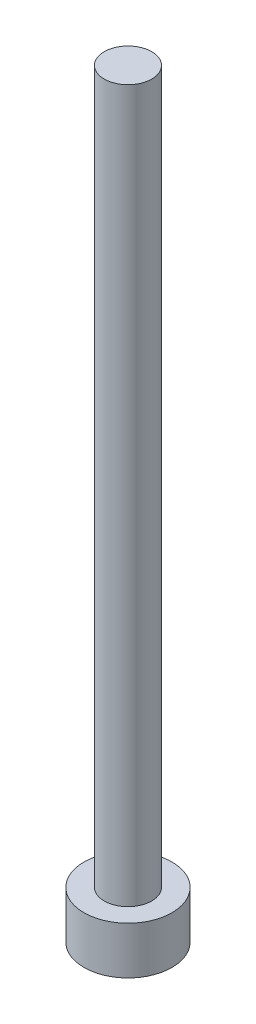
ISO-10303-21;
HEADER;
FILE_DESCRIPTION(('STEP AP214'),'2;1');
FILE_NAME('part.step','',(''),(''),'','','');
FILE_SCHEMA(('AUTOMOTIVE_DESIGN { 1 0 10303 214 1 1 1 1 }'));
ENDSEC;
DATA;
#1=APPLICATION_CONTEXT('core data for automotive mechanical design processes');
#2=APPLICATION_PROTOCOL_DEFINITION('international standard','automotive_design',2000,#1);
#3=PRODUCT_CONTEXT('',#1,'mechanical');
#4=PRODUCT('Part','Part','',(#3));
#5=PRODUCT_RELATED_PRODUCT_CATEGORY('part','',(#4));
#6=PRODUCT_DEFINITION_FORMATION('','',#4);
#7=PRODUCT_DEFINITION_CONTEXT('part definition',#1,'design');
#8=PRODUCT_DEFINITION('design','',#6,#7);
#9=PRODUCT_DEFINITION_SHAPE('','',#8);
#10=(LENGTH_UNIT() NAMED_UNIT(*) SI_UNIT(.MILLI.,.METRE.));
#11=(NAMED_UNIT(*) PLANE_ANGLE_UNIT() SI_UNIT($,.RADIAN.));
#12=(NAMED_UNIT(*) SI_UNIT($,.STERADIAN.) SOLID_ANGLE_UNIT());
#13=UNCERTAINTY_MEASURE_WITH_UNIT(LENGTH_MEASURE(1.E-05),#10,'distance_accuracy_value','');
#14=(GEOMETRIC_REPRESENTATION_CONTEXT(3) GLOBAL_UNCERTAINTY_ASSIGNED_CONTEXT((#13)) GLOBAL_UNIT_ASSIGNED_CONTEXT((#10,
#11,#12)) REPRESENTATION_CONTEXT('',''));
#15=CARTESIAN_POINT('',(0.,0.,0.));
#16=DIRECTION('',(0.,0.,1.));
#17=DIRECTION('',(1.,0.,0.));
#18=AXIS2_PLACEMENT_3D('',#15,#16,#17);
#19=CARTESIAN_POINT('',(0.,3.,0.));
#20=DIRECTION('',(0.,-1.,0.));
#21=DIRECTION('',(0.,0.,-1.));
#22=AXIS2_PLACEMENT_3D('',#19,#20,#21);
#23=CYLINDRICAL_SURFACE('',#22,2.78);
#24=CARTESIAN_POINT('',(0.,3.,0.));
#25=DIRECTION('',(0.,1.,0.));
#26=DIRECTION('',(0.,0.,1.));
#27=AXIS2_PLACEMENT_3D('',#24,#25,#26);
#28=CIRCLE('',#27,2.78);
#29=CARTESIAN_POINT('',(0.,3.,2.78));
#30=VERTEX_POINT('',#29);
#31=EDGE_CURVE('E10',#30,#30,#28,.T.);
#32=ORIENTED_EDGE('',*,*,#31,.F.);
#33=EDGE_LOOP('',(#32));
#34=FACE_BOUND('',#33,.T.);
#35=CARTESIAN_POINT('',(0.,0.,0.));
#36=DIRECTION('',(0.,1.,0.));
#37=DIRECTION('',(0.,0.,1.));
#38=AXIS2_PLACEMENT_3D('',#35,#36,#37);
#39=CIRCLE('',#38,2.78);
#40=CARTESIAN_POINT('',(0.,0.,2.78));
#41=VERTEX_POINT('',#40);
#42=EDGE_CURVE('E35',#41,#41,#39,.T.);
#43=ORIENTED_EDGE('',*,*,#42,.T.);
#44=EDGE_LOOP('',(#43));
#45=FACE_BOUND('',#44,.T.);
#46=ADVANCED_FACE('F32',(#34,#45),#23,.T.);
#47=CARTESIAN_POINT('',(0.,3.,0.));
#48=DIRECTION('',(0.,1.,0.));
#49=DIRECTION('',(0.,0.,1.));
#50=AXIS2_PLACEMENT_3D('',#47,#48,#49);
#51=PLANE('',#50);
#52=CARTESIAN_POINT('',(0.,3.,0.));
#53=DIRECTION('',(0.,1.,0.));
#54=DIRECTION('',(0.,0.,1.));
#55=AXIS2_PLACEMENT_3D('',#52,#53,#54);
#56=CIRCLE('',#55,1.5);
#57=CARTESIAN_POINT('',(0.,3.,-1.5));
#58=VERTEX_POINT('',#57);
#59=EDGE_CURVE('E44',#58,#58,#56,.T.);
#60=ORIENTED_EDGE('',*,*,#59,.F.);
#61=EDGE_LOOP('',(#60));
#62=FACE_BOUND('',#61,.T.);
#63=ORIENTED_EDGE('',*,*,#31,.T.);
#64=EDGE_LOOP('',(#63));
#65=FACE_BOUND('',#64,.T.);
#66=ADVANCED_FACE('F59',(#62,#65),#51,.T.);
#67=CARTESIAN_POINT('',(0.,0.,0.));
#68=DIRECTION('',(0.,1.,0.));
#69=DIRECTION('',(0.,0.,1.));
#70=AXIS2_PLACEMENT_3D('',#67,#68,#69);
#71=PLANE('',#70);
#72=ORIENTED_EDGE('',*,*,#42,.F.);
#73=EDGE_LOOP('',(#72));
#74=FACE_BOUND('',#73,.T.);
#75=ADVANCED_FACE('F55',(#74),#71,.F.);
#76=CARTESIAN_POINT('',(0.,48.,0.));
#77=DIRECTION('',(0.,-1.,0.));
#78=DIRECTION('',(0.,0.,-1.));
#79=AXIS2_PLACEMENT_3D('',#76,#77,#78);
#80=CYLINDRICAL_SURFACE('',#79,1.5);
#81=CARTESIAN_POINT('',(0.,48.,0.));
#82=DIRECTION('',(0.,1.,0.));
#83=DIRECTION('',(0.,0.,1.));
#84=AXIS2_PLACEMENT_3D('',#81,#82,#83);
#85=CIRCLE('',#84,1.5);
#86=CARTESIAN_POINT('',(0.,48.,-1.5));
#87=VERTEX_POINT('',#86);
#88=EDGE_CURVE('E42',#87,#87,#85,.T.);
#89=CARTESIAN_POINT('',(0.,48.,-1.5));
#90=CARTESIAN_POINT('',(0.,47.53125,-1.5));
#91=CARTESIAN_POINT('',(0.,47.0625,-1.5));
#92=CARTESIAN_POINT('',(0.,46.125,-1.5));
#93=CARTESIAN_POINT('',(0.,45.65625,-1.5));
#94=CARTESIAN_POINT('',(0.,44.71875,-1.5));
#95=CARTESIAN_POINT('',(0.,44.25,-1.5));
#96=CARTESIAN_POINT('',(0.,43.3125,-1.5));
#97=CARTESIAN_POINT('',(0.,42.84375,-1.5));
#98=CARTESIAN_POINT('',(0.,41.90625,-1.5));
#99=CARTESIAN_POINT('',(0.,41.4375,-1.5));
#100=CARTESIAN_POINT('',(0.,40.5,-1.5));
#101=CARTESIAN_POINT('',(0.,40.03125,-1.5));
#102=CARTESIAN_POINT('',(0.,39.09375,-1.5));
#103=CARTESIAN_POINT('',(0.,38.625,-1.5));
#104=CARTESIAN_POINT('',(0.,37.6875,-1.5));
#105=CARTESIAN_POINT('',(0.,37.21875,-1.5));
#106=CARTESIAN_POINT('',(0.,36.28125,-1.5));
#107=CARTESIAN_POINT('',(0.,35.8125,-1.5));
#108=CARTESIAN_POINT('',(0.,34.875,-1.5));
#109=CARTESIAN_POINT('',(0.,34.40625,-1.5));
#110=CARTESIAN_POINT('',(0.,33.46875,-1.5));
#111=CARTESIAN_POINT('',(0.,33.,-1.5));
#112=CARTESIAN_POINT('',(0.,32.0625,-1.5));
#113=CARTESIAN_POINT('',(0.,31.59375,-1.5));
#114=CARTESIAN_POINT('',(0.,30.65625,-1.5));
#115=CARTESIAN_POINT('',(0.,30.1875,-1.5));
#116=CARTESIAN_POINT('',(0.,29.25,-1.5));
#117=CARTESIAN_POINT('',(0.,28.78125,-1.5));
#118=CARTESIAN_POINT('',(0.,27.84375,-1.5));
#119=CARTESIAN_POINT('',(0.,27.375,-1.5));
#120=CARTESIAN_POINT('',(0.,26.4375,-1.5));
#121=CARTESIAN_POINT('',(0.,25.96875,-1.5));
#122=CARTESIAN_POINT('',(0.,25.03125,-1.5));
#123=CARTESIAN_POINT('',(0.,24.5625,-1.5));
#124=CARTESIAN_POINT('',(0.,23.625,-1.5));
#125=CARTESIAN_POINT('',(0.,23.15625,-1.5));
#126=CARTESIAN_POINT('',(0.,22.21875,-1.5));
#127=CARTESIAN_POINT('',(0.,21.75,-1.5));
#128=CARTESIAN_POINT('',(0.,20.8125,-1.5));
#129=CARTESIAN_POINT('',(0.,20.34375,-1.5));
#130=CARTESIAN_POINT('',(0.,19.40625,-1.5));
#131=CARTESIAN_POINT('',(0.,18.9375,-1.5));
#132=CARTESIAN_POINT('',(0.,18.,-1.5));
#133=CARTESIAN_POINT('',(0.,17.53125,-1.5));
#134=CARTESIAN_POINT('',(0.,16.59375,-1.5));
#135=CARTESIAN_POINT('',(0.,16.125,-1.5));
#136=CARTESIAN_POINT('',(0.,15.1875,-1.5));
#137=CARTESIAN_POINT('',(0.,14.71875,-1.5));
#138=CARTESIAN_POINT('',(0.,13.78125,-1.5));
#139=CARTESIAN_POINT('',(0.,13.3125,-1.5));
#140=CARTESIAN_POINT('',(0.,12.375,-1.5));
#141=CARTESIAN_POINT('',(0.,11.90625,-1.5));
#142=CARTESIAN_POINT('',(0.,10.96875,-1.5));
#143=CARTESIAN_POINT('',(0.,10.5,-1.5));
#144=CARTESIAN_POINT('',(0.,9.5625,-1.5));
#145=CARTESIAN_POINT('',(0.,9.09375,-1.5));
#146=CARTESIAN_POINT('',(0.,8.15624999999999,-1.5));
#147=CARTESIAN_POINT('',(0.,7.6875,-1.5));
#148=CARTESIAN_POINT('',(0.,6.75,-1.5));
#149=CARTESIAN_POINT('',(0.,6.28125,-1.5));
#150=CARTESIAN_POINT('',(0.,5.34375,-1.5));
#151=CARTESIAN_POINT('',(0.,4.87499999999999,-1.5));
#152=CARTESIAN_POINT('',(0.,3.93749999999999,-1.5));
#153=CARTESIAN_POINT('',(0.,3.46875,-1.5));
#154=CARTESIAN_POINT('',(0.,3.,-1.5));
#155=B_SPLINE_CURVE_WITH_KNOTS('',3,(#89,#90,#91,#92,#93,#94,#95,#96,#97,#98,#99,#100,#101,#102,
#103,#104,#105,#106,#107,#108,#109,#110,#111,#112,#113,#114,#115,#116,#117,#118,#119,#120,#121,
#122,#123,#124,#125,#126,#127,#128,#129,#130,#131,#132,#133,#134,#135,#136,#137,#138,#139,#140,
#141,#142,#143,#144,#145,#146,#147,#148,#149,#150,#151,#152,#153,#154),.UNSPECIFIED.,.F.,.F.,(4,
2,2,2,2,2,2,2,2,2,2,2,2,2,2,2,2,2,2,2,2,2,2,2,2,2,2,2,2,2,2,2,4),(0.,1.40625,2.8125,
4.21874999999999,5.625,7.03125,8.43749999999999,9.84375,11.25,12.65625,14.0625,15.46875,16.875,
18.28125,19.6875,21.09375,22.5,23.90625,25.3125,26.71875,28.125,29.53125,30.9375,32.34375,33.75,
35.15625,36.5625,37.96875,39.375,40.78125,42.1875,43.59375,45.),.UNSPECIFIED.);
#156=EDGE_CURVE('BSEAM52',#87,#58,#155,.T.);
#157=ORIENTED_EDGE('',*,*,#88,.F.);
#158=ORIENTED_EDGE('',*,*,#59,.T.);
#159=ORIENTED_EDGE('',*,*,#156,.T.);
#160=ORIENTED_EDGE('',*,*,#156,.F.);
#161=EDGE_LOOP('',(#157,#159,#158,#160));
#162=FACE_BOUND('',#161,.T.);
#163=ADVANCED_FACE('F52',(#162),#80,.T.);
#164=CARTESIAN_POINT('',(0.,48.,0.));
#165=DIRECTION('',(0.,1.,0.));
#166=DIRECTION('',(0.,0.,1.));
#167=AXIS2_PLACEMENT_3D('',#164,#165,#166);
#168=PLANE('',#167);
#169=ORIENTED_EDGE('',*,*,#88,.T.);
#170=EDGE_LOOP('',(#169));
#171=FACE_BOUND('',#170,.T.);
#172=ADVANCED_FACE('F50',(#171),#168,.T.);
#173=CLOSED_SHELL('',(#46,#66,#75,#163,#172));
#174=MANIFOLD_SOLID_BREP('B2',#173);
#175=ADVANCED_BREP_SHAPE_REPRESENTATION('',(#18,#174),#14);
#176=SHAPE_DEFINITION_REPRESENTATION(#9,#175);
ENDSEC;
END-ISO-10303-21;
